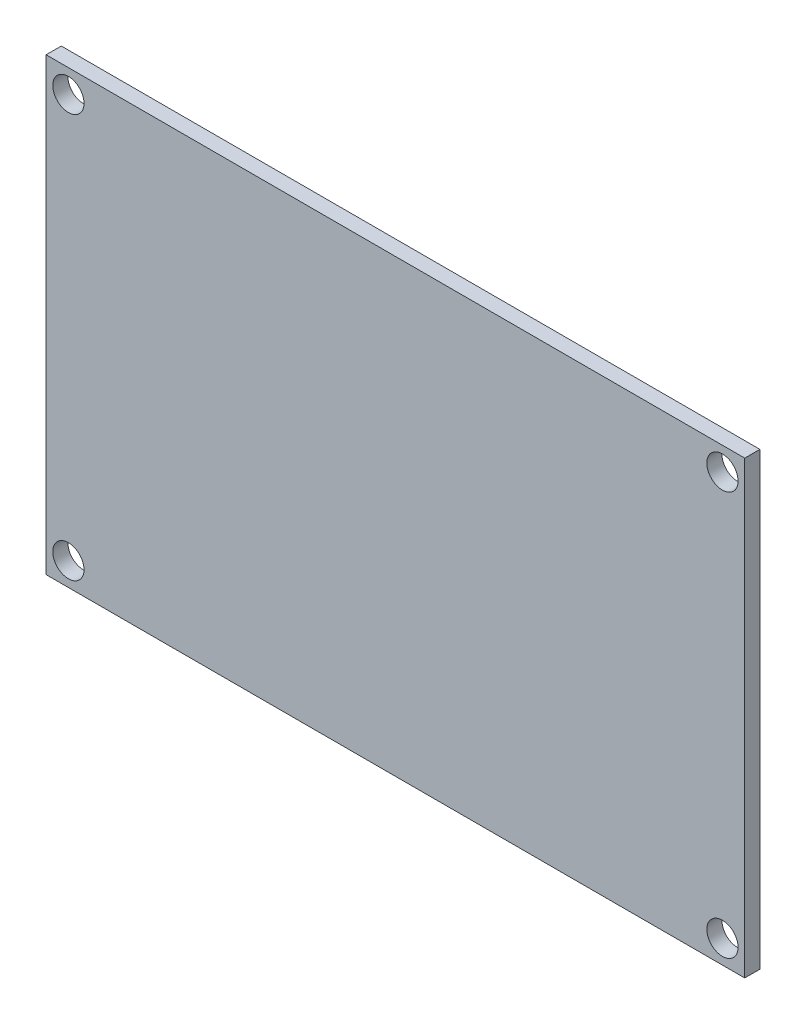
ISO-10303-21;
HEADER;
FILE_DESCRIPTION(('STEP AP214'),'2;1');
FILE_NAME('part.step','',(''),(''),'','','');
FILE_SCHEMA(('AUTOMOTIVE_DESIGN { 1 0 10303 214 1 1 1 1 }'));
ENDSEC;
DATA;
#1=APPLICATION_CONTEXT('core data for automotive mechanical design processes');
#2=APPLICATION_PROTOCOL_DEFINITION('international standard','automotive_design',2000,#1);
#3=PRODUCT_CONTEXT('',#1,'mechanical');
#4=PRODUCT('Part','Part','',(#3));
#5=PRODUCT_RELATED_PRODUCT_CATEGORY('part','',(#4));
#6=PRODUCT_DEFINITION_FORMATION('','',#4);
#7=PRODUCT_DEFINITION_CONTEXT('part definition',#1,'design');
#8=PRODUCT_DEFINITION('design','',#6,#7);
#9=PRODUCT_DEFINITION_SHAPE('','',#8);
#10=(LENGTH_UNIT() NAMED_UNIT(*) SI_UNIT(.MILLI.,.METRE.));
#11=(NAMED_UNIT(*) PLANE_ANGLE_UNIT() SI_UNIT($,.RADIAN.));
#12=(NAMED_UNIT(*) SI_UNIT($,.STERADIAN.) SOLID_ANGLE_UNIT());
#13=UNCERTAINTY_MEASURE_WITH_UNIT(LENGTH_MEASURE(1.E-05),#10,'distance_accuracy_value','');
#14=(GEOMETRIC_REPRESENTATION_CONTEXT(3) GLOBAL_UNCERTAINTY_ASSIGNED_CONTEXT((#13)) GLOBAL_UNIT_ASSIGNED_CONTEXT((#10,
#11,#12)) REPRESENTATION_CONTEXT('',''));
#15=CARTESIAN_POINT('',(0.,0.,0.));
#16=DIRECTION('',(0.,0.,1.));
#17=DIRECTION('',(1.,0.,0.));
#18=AXIS2_PLACEMENT_3D('',#15,#16,#17);
#19=CARTESIAN_POINT('',(0.,0.,1.6));
#20=DIRECTION('',(0.,0.,-1.));
#21=DIRECTION('',(-1.,0.,0.));
#22=AXIS2_PLACEMENT_3D('',#19,#20,#21);
#23=PLANE('',#22);
#24=DIRECTION('',(0.,-1.,0.));
#25=VECTOR('',#24,1.);
#26=CARTESIAN_POINT('',(0.,0.,1.6));
#27=LINE('',#26,#25);
#28=CARTESIAN_POINT('',(0.,47.5,1.6));
#29=VERTEX_POINT('',#28);
#30=CARTESIAN_POINT('',(0.,0.,1.6));
#31=VERTEX_POINT('',#30);
#32=EDGE_CURVE('E85',#29,#31,#27,.T.);
#33=ORIENTED_EDGE('',*,*,#32,.T.);
#34=DIRECTION('',(1.,0.,0.));
#35=VECTOR('',#34,1.);
#36=CARTESIAN_POINT('',(0.,0.,1.6));
#37=LINE('',#36,#35);
#38=CARTESIAN_POINT('',(73.7,0.,1.6));
#39=VERTEX_POINT('',#38);
#40=EDGE_CURVE('E80',#31,#39,#37,.T.);
#41=ORIENTED_EDGE('',*,*,#40,.T.);
#42=DIRECTION('',(0.,1.,0.));
#43=VECTOR('',#42,1.);
#44=CARTESIAN_POINT('',(73.7,0.,1.6));
#45=LINE('',#44,#43);
#46=CARTESIAN_POINT('',(73.7,47.5,1.6));
#47=VERTEX_POINT('',#46);
#48=EDGE_CURVE('E83',#39,#47,#45,.T.);
#49=ORIENTED_EDGE('',*,*,#48,.T.);
#50=DIRECTION('',(-1.,0.,0.));
#51=VECTOR('',#50,1.);
#52=CARTESIAN_POINT('',(0.,47.5,1.6));
#53=LINE('',#52,#51);
#54=EDGE_CURVE('E50',#47,#29,#53,.T.);
#55=ORIENTED_EDGE('',*,*,#54,.T.);
#56=EDGE_LOOP('',(#33,#41,#49,#55));
#57=FACE_BOUND('',#56,.T.);
#58=CARTESIAN_POINT('',(2.35,45.05,1.6));
#59=DIRECTION('',(0.,0.,1.));
#60=DIRECTION('',(1.,0.,0.));
#61=AXIS2_PLACEMENT_3D('',#58,#59,#60);
#62=CIRCLE('',#61,1.65);
#63=CARTESIAN_POINT('',(4.,45.05,1.6));
#64=VERTEX_POINT('',#63);
#65=EDGE_CURVE('E100',#64,#64,#62,.T.);
#66=ORIENTED_EDGE('',*,*,#65,.F.);
#67=EDGE_LOOP('',(#66));
#68=FACE_BOUND('',#67,.T.);
#69=CARTESIAN_POINT('',(71.35,45.05,1.6));
#70=DIRECTION('',(0.,0.,1.));
#71=DIRECTION('',(1.,0.,0.));
#72=AXIS2_PLACEMENT_3D('',#69,#70,#71);
#73=CIRCLE('',#72,1.65);
#74=CARTESIAN_POINT('',(73.,45.05,1.6));
#75=VERTEX_POINT('',#74);
#76=EDGE_CURVE('E115',#75,#75,#73,.T.);
#77=ORIENTED_EDGE('',*,*,#76,.F.);
#78=EDGE_LOOP('',(#77));
#79=FACE_BOUND('',#78,.T.);
#80=CARTESIAN_POINT('',(2.35,2.45,1.6));
#81=DIRECTION('',(0.,0.,1.));
#82=DIRECTION('',(1.,0.,0.));
#83=AXIS2_PLACEMENT_3D('',#80,#81,#82);
#84=CIRCLE('',#83,1.65);
#85=CARTESIAN_POINT('',(4.00000000000001,2.45,1.6));
#86=VERTEX_POINT('',#85);
#87=EDGE_CURVE('E121',#86,#86,#84,.T.);
#88=ORIENTED_EDGE('',*,*,#87,.F.);
#89=EDGE_LOOP('',(#88));
#90=FACE_BOUND('',#89,.T.);
#91=CARTESIAN_POINT('',(71.35,2.45,1.6));
#92=DIRECTION('',(0.,0.,1.));
#93=DIRECTION('',(1.,0.,0.));
#94=AXIS2_PLACEMENT_3D('',#91,#92,#93);
#95=CIRCLE('',#94,1.65);
#96=CARTESIAN_POINT('',(73.,2.45,1.6));
#97=VERTEX_POINT('',#96);
#98=EDGE_CURVE('E127',#97,#97,#95,.T.);
#99=ORIENTED_EDGE('',*,*,#98,.F.);
#100=EDGE_LOOP('',(#99));
#101=FACE_BOUND('',#100,.T.);
#102=ADVANCED_FACE('F33',(#57,#68,#79,#90,#101),#23,.F.);
#103=CARTESIAN_POINT('',(0.,0.,0.));
#104=DIRECTION('',(0.,0.,-1.));
#105=DIRECTION('',(-1.,0.,0.));
#106=AXIS2_PLACEMENT_3D('',#103,#104,#105);
#107=PLANE('',#106);
#108=CARTESIAN_POINT('',(2.35,2.45,0.));
#109=DIRECTION('',(0.,0.,1.));
#110=DIRECTION('',(1.,0.,0.));
#111=AXIS2_PLACEMENT_3D('',#108,#109,#110);
#112=CIRCLE('',#111,1.65);
#113=CARTESIAN_POINT('',(4.00000000000001,2.45,0.));
#114=VERTEX_POINT('',#113);
#115=EDGE_CURVE('E124',#114,#114,#112,.T.);
#116=ORIENTED_EDGE('',*,*,#115,.T.);
#117=EDGE_LOOP('',(#116));
#118=FACE_BOUND('',#117,.T.);
#119=CARTESIAN_POINT('',(2.35,45.05,0.));
#120=DIRECTION('',(0.,0.,1.));
#121=DIRECTION('',(1.,0.,0.));
#122=AXIS2_PLACEMENT_3D('',#119,#120,#121);
#123=CIRCLE('',#122,1.65);
#124=CARTESIAN_POINT('',(4.,45.05,0.));
#125=VERTEX_POINT('',#124);
#126=EDGE_CURVE('E112',#125,#125,#123,.T.);
#127=ORIENTED_EDGE('',*,*,#126,.T.);
#128=EDGE_LOOP('',(#127));
#129=FACE_BOUND('',#128,.T.);
#130=DIRECTION('',(0.,-1.,0.));
#131=VECTOR('',#130,1.);
#132=CARTESIAN_POINT('',(0.,0.,0.));
#133=LINE('',#132,#131);
#134=CARTESIAN_POINT('',(0.,47.5,0.));
#135=VERTEX_POINT('',#134);
#136=CARTESIAN_POINT('',(0.,0.,0.));
#137=VERTEX_POINT('',#136);
#138=EDGE_CURVE('E97',#135,#137,#133,.T.);
#139=ORIENTED_EDGE('',*,*,#138,.F.);
#140=DIRECTION('',(-1.,0.,0.));
#141=VECTOR('',#140,1.);
#142=CARTESIAN_POINT('',(0.,47.5,0.));
#143=LINE('',#142,#141);
#144=CARTESIAN_POINT('',(73.7,47.5,0.));
#145=VERTEX_POINT('',#144);
#146=EDGE_CURVE('E73',#145,#135,#143,.T.);
#147=ORIENTED_EDGE('',*,*,#146,.F.);
#148=DIRECTION('',(0.,1.,0.));
#149=VECTOR('',#148,1.);
#150=CARTESIAN_POINT('',(73.7,0.,0.));
#151=LINE('',#150,#149);
#152=CARTESIAN_POINT('',(73.7,0.,0.));
#153=VERTEX_POINT('',#152);
#154=EDGE_CURVE('E67',#153,#145,#151,.T.);
#155=ORIENTED_EDGE('',*,*,#154,.F.);
#156=DIRECTION('',(1.,0.,0.));
#157=VECTOR('',#156,1.);
#158=CARTESIAN_POINT('',(0.,0.,0.));
#159=LINE('',#158,#157);
#160=EDGE_CURVE('E89',#137,#153,#159,.T.);
#161=ORIENTED_EDGE('',*,*,#160,.F.);
#162=EDGE_LOOP('',(#139,#147,#155,#161));
#163=FACE_BOUND('',#162,.T.);
#164=CARTESIAN_POINT('',(71.35,45.05,0.));
#165=DIRECTION('',(0.,0.,1.));
#166=DIRECTION('',(1.,0.,0.));
#167=AXIS2_PLACEMENT_3D('',#164,#165,#166);
#168=CIRCLE('',#167,1.65);
#169=CARTESIAN_POINT('',(73.,45.05,0.));
#170=VERTEX_POINT('',#169);
#171=EDGE_CURVE('E118',#170,#170,#168,.T.);
#172=ORIENTED_EDGE('',*,*,#171,.T.);
#173=EDGE_LOOP('',(#172));
#174=FACE_BOUND('',#173,.T.);
#175=CARTESIAN_POINT('',(71.35,2.45,0.));
#176=DIRECTION('',(0.,0.,1.));
#177=DIRECTION('',(1.,0.,0.));
#178=AXIS2_PLACEMENT_3D('',#175,#176,#177);
#179=CIRCLE('',#178,1.65);
#180=CARTESIAN_POINT('',(73.,2.45,0.));
#181=VERTEX_POINT('',#180);
#182=EDGE_CURVE('E130',#181,#181,#179,.T.);
#183=ORIENTED_EDGE('',*,*,#182,.T.);
#184=EDGE_LOOP('',(#183));
#185=FACE_BOUND('',#184,.T.);
#186=ADVANCED_FACE('F108',(#118,#129,#163,#174,#185),#107,.T.);
#187=CARTESIAN_POINT('',(0.,0.,1.6));
#188=DIRECTION('',(1.,0.,0.));
#189=DIRECTION('',(0.,0.,-1.));
#190=AXIS2_PLACEMENT_3D('',#187,#188,#189);
#191=PLANE('',#190);
#192=ORIENTED_EDGE('',*,*,#138,.T.);
#193=DIRECTION('',(0.,0.,-1.));
#194=VECTOR('',#193,1.);
#195=CARTESIAN_POINT('',(0.,0.,1.6));
#196=LINE('',#195,#194);
#197=EDGE_CURVE('E11',#31,#137,#196,.T.);
#198=ORIENTED_EDGE('',*,*,#197,.F.);
#199=ORIENTED_EDGE('',*,*,#32,.F.);
#200=DIRECTION('',(0.,0.,-1.));
#201=VECTOR('',#200,1.);
#202=CARTESIAN_POINT('',(0.,47.5,1.6));
#203=LINE('',#202,#201);
#204=EDGE_CURVE('E93',#29,#135,#203,.T.);
#205=ORIENTED_EDGE('',*,*,#204,.T.);
#206=EDGE_LOOP('',(#192,#198,#199,#205));
#207=FACE_BOUND('',#206,.T.);
#208=ADVANCED_FACE('F35',(#207),#191,.F.);
#209=CARTESIAN_POINT('',(0.,0.,1.6));
#210=DIRECTION('',(0.,1.,0.));
#211=DIRECTION('',(0.,0.,1.));
#212=AXIS2_PLACEMENT_3D('',#209,#210,#211);
#213=PLANE('',#212);
#214=ORIENTED_EDGE('',*,*,#160,.T.);
#215=DIRECTION('',(0.,0.,-1.));
#216=VECTOR('',#215,1.);
#217=CARTESIAN_POINT('',(73.7,0.,1.6));
#218=LINE('',#217,#216);
#219=EDGE_CURVE('E42',#39,#153,#218,.T.);
#220=ORIENTED_EDGE('',*,*,#219,.F.);
#221=ORIENTED_EDGE('',*,*,#40,.F.);
#222=ORIENTED_EDGE('',*,*,#197,.T.);
#223=EDGE_LOOP('',(#214,#220,#221,#222));
#224=FACE_BOUND('',#223,.T.);
#225=ADVANCED_FACE('F88',(#224),#213,.F.);
#226=CARTESIAN_POINT('',(73.7,0.,1.6));
#227=DIRECTION('',(-1.,0.,0.));
#228=DIRECTION('',(0.,0.,1.));
#229=AXIS2_PLACEMENT_3D('',#226,#227,#228);
#230=PLANE('',#229);
#231=ORIENTED_EDGE('',*,*,#154,.T.);
#232=DIRECTION('',(0.,0.,-1.));
#233=VECTOR('',#232,1.);
#234=CARTESIAN_POINT('',(73.7,47.5,1.6));
#235=LINE('',#234,#233);
#236=EDGE_CURVE('E90',#47,#145,#235,.T.);
#237=ORIENTED_EDGE('',*,*,#236,.F.);
#238=ORIENTED_EDGE('',*,*,#48,.F.);
#239=ORIENTED_EDGE('',*,*,#219,.T.);
#240=EDGE_LOOP('',(#231,#237,#238,#239));
#241=FACE_BOUND('',#240,.T.);
#242=ADVANCED_FACE('F91',(#241),#230,.F.);
#243=CARTESIAN_POINT('',(0.,47.5,1.6));
#244=DIRECTION('',(0.,-1.,0.));
#245=DIRECTION('',(0.,0.,-1.));
#246=AXIS2_PLACEMENT_3D('',#243,#244,#245);
#247=PLANE('',#246);
#248=ORIENTED_EDGE('',*,*,#146,.T.);
#249=ORIENTED_EDGE('',*,*,#204,.F.);
#250=ORIENTED_EDGE('',*,*,#54,.F.);
#251=ORIENTED_EDGE('',*,*,#236,.T.);
#252=EDGE_LOOP('',(#248,#249,#250,#251));
#253=FACE_BOUND('',#252,.T.);
#254=ADVANCED_FACE('F105',(#253),#247,.F.);
#255=CARTESIAN_POINT('',(2.35,45.05,1.6));
#256=DIRECTION('',(0.,0.,-1.));
#257=DIRECTION('',(-1.,0.,0.));
#258=AXIS2_PLACEMENT_3D('',#255,#256,#257);
#259=CYLINDRICAL_SURFACE('',#258,1.65);
#260=ORIENTED_EDGE('',*,*,#65,.T.);
#261=EDGE_LOOP('',(#260));
#262=FACE_BOUND('',#261,.T.);
#263=ORIENTED_EDGE('',*,*,#126,.F.);
#264=EDGE_LOOP('',(#263));
#265=FACE_BOUND('',#264,.T.);
#266=ADVANCED_FACE('F147',(#262,#265),#259,.F.);
#267=CARTESIAN_POINT('',(71.35,45.05,1.6));
#268=DIRECTION('',(0.,0.,-1.));
#269=DIRECTION('',(-1.,0.,0.));
#270=AXIS2_PLACEMENT_3D('',#267,#268,#269);
#271=CYLINDRICAL_SURFACE('',#270,1.65);
#272=ORIENTED_EDGE('',*,*,#76,.T.);
#273=EDGE_LOOP('',(#272));
#274=FACE_BOUND('',#273,.T.);
#275=ORIENTED_EDGE('',*,*,#171,.F.);
#276=EDGE_LOOP('',(#275));
#277=FACE_BOUND('',#276,.T.);
#278=ADVANCED_FACE('F193',(#274,#277),#271,.F.);
#279=CARTESIAN_POINT('',(2.35,2.45,1.6));
#280=DIRECTION('',(0.,0.,-1.));
#281=DIRECTION('',(-1.,0.,0.));
#282=AXIS2_PLACEMENT_3D('',#279,#280,#281);
#283=CYLINDRICAL_SURFACE('',#282,1.65);
#284=ORIENTED_EDGE('',*,*,#87,.T.);
#285=EDGE_LOOP('',(#284));
#286=FACE_BOUND('',#285,.T.);
#287=ORIENTED_EDGE('',*,*,#115,.F.);
#288=EDGE_LOOP('',(#287));
#289=FACE_BOUND('',#288,.T.);
#290=ADVANCED_FACE('F201',(#286,#289),#283,.F.);
#291=CARTESIAN_POINT('',(71.35,2.45,1.6));
#292=DIRECTION('',(0.,0.,-1.));
#293=DIRECTION('',(-1.,0.,0.));
#294=AXIS2_PLACEMENT_3D('',#291,#292,#293);
#295=CYLINDRICAL_SURFACE('',#294,1.65);
#296=ORIENTED_EDGE('',*,*,#98,.T.);
#297=EDGE_LOOP('',(#296));
#298=FACE_BOUND('',#297,.T.);
#299=ORIENTED_EDGE('',*,*,#182,.F.);
#300=EDGE_LOOP('',(#299));
#301=FACE_BOUND('',#300,.T.);
#302=ADVANCED_FACE('F136',(#298,#301),#295,.F.);
#303=CLOSED_SHELL('',(#102,#186,#208,#225,#242,#254,#266,#278,#290,#302));
#304=MANIFOLD_SOLID_BREP('B2',#303);
#305=ADVANCED_BREP_SHAPE_REPRESENTATION('',(#18,#304),#14);
#306=SHAPE_DEFINITION_REPRESENTATION(#9,#305);
ENDSEC;
END-ISO-10303-21;
